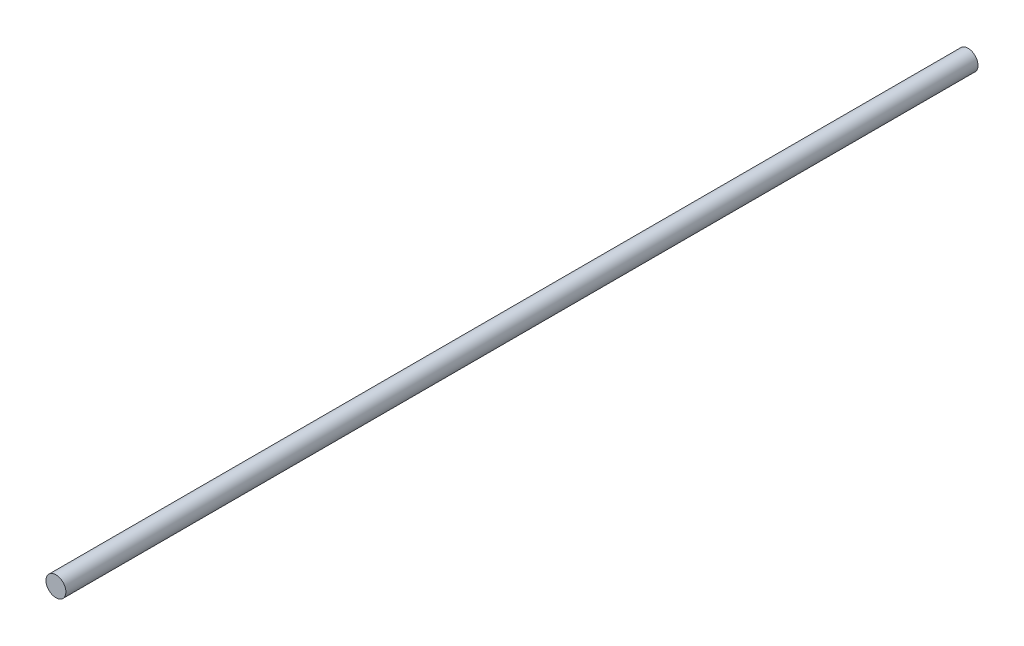
ISO-10303-21;
HEADER;
FILE_DESCRIPTION(('STEP AP214'),'2;1');
FILE_NAME('part.step','',(''),(''),'','','');
FILE_SCHEMA(('AUTOMOTIVE_DESIGN { 1 0 10303 214 1 1 1 1 }'));
ENDSEC;
DATA;
#1=APPLICATION_CONTEXT('core data for automotive mechanical design processes');
#2=APPLICATION_PROTOCOL_DEFINITION('international standard','automotive_design',2000,#1);
#3=PRODUCT_CONTEXT('',#1,'mechanical');
#4=PRODUCT('Part','Part','',(#3));
#5=PRODUCT_RELATED_PRODUCT_CATEGORY('part','',(#4));
#6=PRODUCT_DEFINITION_FORMATION('','',#4);
#7=PRODUCT_DEFINITION_CONTEXT('part definition',#1,'design');
#8=PRODUCT_DEFINITION('design','',#6,#7);
#9=PRODUCT_DEFINITION_SHAPE('','',#8);
#10=(LENGTH_UNIT() NAMED_UNIT(*) SI_UNIT(.MILLI.,.METRE.));
#11=(NAMED_UNIT(*) PLANE_ANGLE_UNIT() SI_UNIT($,.RADIAN.));
#12=(NAMED_UNIT(*) SI_UNIT($,.STERADIAN.) SOLID_ANGLE_UNIT());
#13=UNCERTAINTY_MEASURE_WITH_UNIT(LENGTH_MEASURE(1.E-05),#10,'distance_accuracy_value','');
#14=(GEOMETRIC_REPRESENTATION_CONTEXT(3) GLOBAL_UNCERTAINTY_ASSIGNED_CONTEXT((#13)) GLOBAL_UNIT_ASSIGNED_CONTEXT((#10,
#11,#12)) REPRESENTATION_CONTEXT('',''));
#15=CARTESIAN_POINT('',(0.,0.,0.));
#16=DIRECTION('',(0.,0.,1.));
#17=DIRECTION('',(1.,0.,0.));
#18=AXIS2_PLACEMENT_3D('',#15,#16,#17);
#19=CARTESIAN_POINT('',(-933.000000000001,963.999999999997,550.));
#20=DIRECTION('',(0.,0.,-1.));
#21=DIRECTION('',(-1.,0.,0.));
#22=AXIS2_PLACEMENT_3D('',#19,#20,#21);
#23=CYLINDRICAL_SURFACE('',#22,5.99999999999999);
#24=CARTESIAN_POINT('',(-933.000000000001,963.999999999997,550.));
#25=DIRECTION('',(0.,0.,1.));
#26=DIRECTION('',(1.,0.,0.));
#27=AXIS2_PLACEMENT_3D('',#24,#25,#26);
#28=CIRCLE('',#27,5.99999999999999);
#29=CARTESIAN_POINT('',(-927.000000000001,963.999999999997,550.));
#30=VERTEX_POINT('',#29);
#31=EDGE_CURVE('E10',#30,#30,#28,.T.);
#32=ORIENTED_EDGE('',*,*,#31,.F.);
#33=EDGE_LOOP('',(#32));
#34=FACE_BOUND('',#33,.T.);
#35=CARTESIAN_POINT('',(-933.000000000001,963.999999999997,0.));
#36=DIRECTION('',(0.,0.,1.));
#37=DIRECTION('',(1.,0.,0.));
#38=AXIS2_PLACEMENT_3D('',#35,#36,#37);
#39=CIRCLE('',#38,5.99999999999999);
#40=CARTESIAN_POINT('',(-927.000000000001,963.999999999997,0.));
#41=VERTEX_POINT('',#40);
#42=EDGE_CURVE('E33',#41,#41,#39,.T.);
#43=ORIENTED_EDGE('',*,*,#42,.T.);
#44=EDGE_LOOP('',(#43));
#45=FACE_BOUND('',#44,.T.);
#46=ADVANCED_FACE('F30',(#34,#45),#23,.T.);
#47=CARTESIAN_POINT('',(-933.000000000001,963.999999999997,550.));
#48=DIRECTION('',(0.,0.,1.));
#49=DIRECTION('',(1.,0.,0.));
#50=AXIS2_PLACEMENT_3D('',#47,#48,#49);
#51=PLANE('',#50);
#52=ORIENTED_EDGE('',*,*,#31,.T.);
#53=EDGE_LOOP('',(#52));
#54=FACE_BOUND('',#53,.T.);
#55=ADVANCED_FACE('F45',(#54),#51,.T.);
#56=CARTESIAN_POINT('',(-933.000000000001,963.999999999997,0.));
#57=DIRECTION('',(0.,0.,1.));
#58=DIRECTION('',(1.,0.,0.));
#59=AXIS2_PLACEMENT_3D('',#56,#57,#58);
#60=PLANE('',#59);
#61=ORIENTED_EDGE('',*,*,#42,.F.);
#62=EDGE_LOOP('',(#61));
#63=FACE_BOUND('',#62,.T.);
#64=ADVANCED_FACE('F43',(#63),#60,.F.);
#65=CLOSED_SHELL('',(#46,#55,#64));
#66=MANIFOLD_SOLID_BREP('B2',#65);
#67=ADVANCED_BREP_SHAPE_REPRESENTATION('',(#18,#66),#14);
#68=SHAPE_DEFINITION_REPRESENTATION(#9,#67);
ENDSEC;
END-ISO-10303-21;
